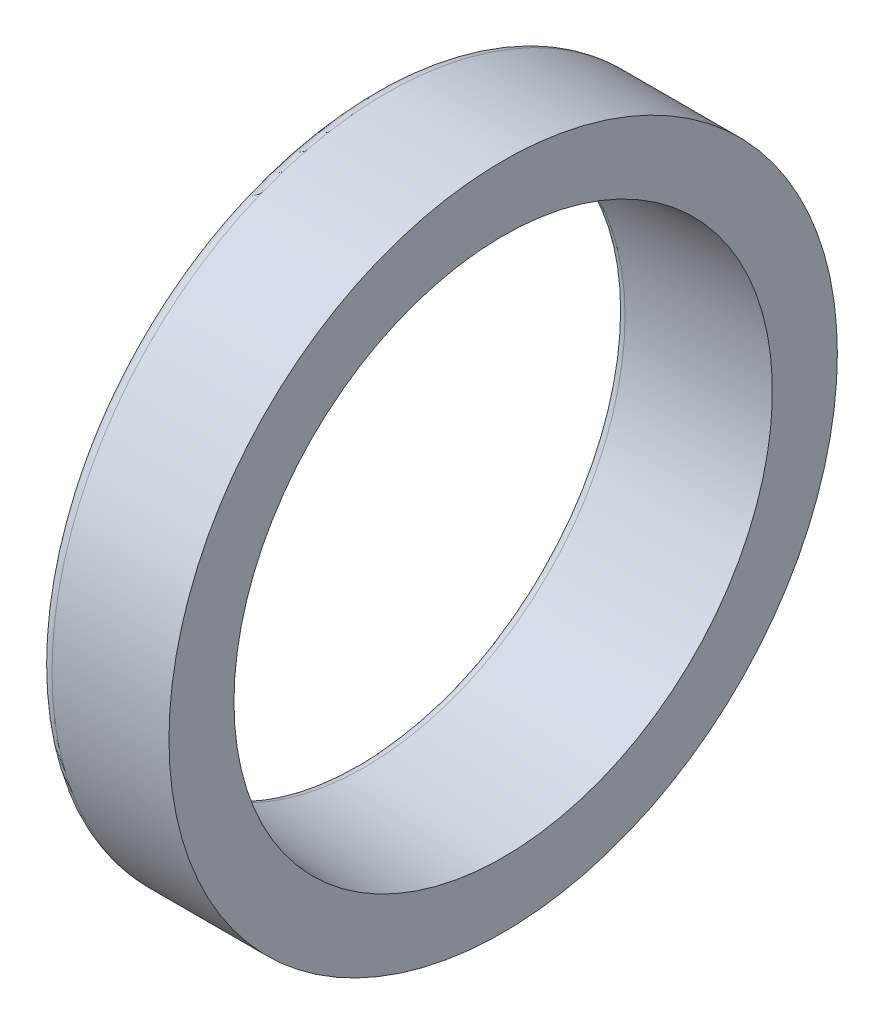
ISO-10303-21;
HEADER;
FILE_DESCRIPTION(('STEP AP214'),'2;1');
FILE_NAME('part.step','',(''),(''),'','','');
FILE_SCHEMA(('AUTOMOTIVE_DESIGN { 1 0 10303 214 1 1 1 1 }'));
ENDSEC;
DATA;
#1=APPLICATION_CONTEXT('core data for automotive mechanical design processes');
#2=APPLICATION_PROTOCOL_DEFINITION('international standard','automotive_design',2000,#1);
#3=PRODUCT_CONTEXT('',#1,'mechanical');
#4=PRODUCT('Part','Part','',(#3));
#5=PRODUCT_RELATED_PRODUCT_CATEGORY('part','',(#4));
#6=PRODUCT_DEFINITION_FORMATION('','',#4);
#7=PRODUCT_DEFINITION_CONTEXT('part definition',#1,'design');
#8=PRODUCT_DEFINITION('design','',#6,#7);
#9=PRODUCT_DEFINITION_SHAPE('','',#8);
#10=(LENGTH_UNIT() NAMED_UNIT(*) SI_UNIT(.MILLI.,.METRE.));
#11=(NAMED_UNIT(*) PLANE_ANGLE_UNIT() SI_UNIT($,.RADIAN.));
#12=(NAMED_UNIT(*) SI_UNIT($,.STERADIAN.) SOLID_ANGLE_UNIT());
#13=UNCERTAINTY_MEASURE_WITH_UNIT(LENGTH_MEASURE(1.E-05),#10,'distance_accuracy_value','');
#14=(GEOMETRIC_REPRESENTATION_CONTEXT(3) GLOBAL_UNCERTAINTY_ASSIGNED_CONTEXT((#13)) GLOBAL_UNIT_ASSIGNED_CONTEXT((#10,
#11,#12)) REPRESENTATION_CONTEXT('',''));
#15=CARTESIAN_POINT('',(0.,0.,0.));
#16=DIRECTION('',(0.,0.,1.));
#17=DIRECTION('',(1.,0.,0.));
#18=AXIS2_PLACEMENT_3D('',#15,#16,#17);
#19=CARTESIAN_POINT('',(-14.021409336133,0.,0.));
#20=DIRECTION('',(-1.,0.,0.));
#21=DIRECTION('',(0.,0.,1.));
#22=AXIS2_PLACEMENT_3D('',#19,#20,#21);
#23=CYLINDRICAL_SURFACE('',#22,18.);
#24=CARTESIAN_POINT('',(-5.3,0.,0.));
#25=DIRECTION('',(-1.,0.,0.));
#26=DIRECTION('',(0.,0.,1.));
#27=AXIS2_PLACEMENT_3D('',#24,#25,#26);
#28=CIRCLE('',#27,18.);
#29=CARTESIAN_POINT('',(-5.3,0.,18.));
#30=VERTEX_POINT('',#29);
#31=EDGE_CURVE('E55',#30,#30,#28,.T.);
#32=ORIENTED_EDGE('',*,*,#31,.F.);
#33=EDGE_LOOP('',(#32));
#34=FACE_BOUND('',#33,.T.);
#35=CARTESIAN_POINT('',(1.,0.,0.));
#36=DIRECTION('',(-1.,0.,0.));
#37=DIRECTION('',(0.,0.,1.));
#38=AXIS2_PLACEMENT_3D('',#35,#36,#37);
#39=CIRCLE('',#38,18.);
#40=CARTESIAN_POINT('',(1.,0.,18.));
#41=VERTEX_POINT('',#40);
#42=EDGE_CURVE('E67',#41,#41,#39,.T.);
#43=ORIENTED_EDGE('',*,*,#42,.T.);
#44=EDGE_LOOP('',(#43));
#45=FACE_BOUND('',#44,.T.);
#46=ADVANCED_FACE('F35',(#34,#45),#23,.T.);
#47=CARTESIAN_POINT('',(-5.3,0.,0.));
#48=DIRECTION('',(-1.,0.,0.));
#49=DIRECTION('',(0.,0.,1.));
#50=AXIS2_PLACEMENT_3D('',#47,#48,#49);
#51=TOROIDAL_SURFACE('',#50,17.3,0.700000000000001);
#52=CARTESIAN_POINT('',(-5.3,0.,0.));
#53=DIRECTION('',(-1.,0.,0.));
#54=DIRECTION('',(0.,0.,1.));
#55=AXIS2_PLACEMENT_3D('',#52,#53,#54);
#56=CIRCLE('',#55,16.6);
#57=CARTESIAN_POINT('',(-5.3,0.,16.6));
#58=VERTEX_POINT('',#57);
#59=EDGE_CURVE('E58',#58,#58,#56,.T.);
#60=ORIENTED_EDGE('',*,*,#59,.F.);
#61=EDGE_LOOP('',(#60));
#62=FACE_BOUND('',#61,.T.);
#63=ORIENTED_EDGE('',*,*,#31,.T.);
#64=EDGE_LOOP('',(#63));
#65=FACE_BOUND('',#64,.T.);
#66=ADVANCED_FACE('F91',(#62,#65),#51,.T.);
#67=CARTESIAN_POINT('',(-5.3,0.,0.));
#68=DIRECTION('',(-1.,0.,0.));
#69=DIRECTION('',(0.,0.,1.));
#70=AXIS2_PLACEMENT_3D('',#67,#68,#69);
#71=TOROIDAL_SURFACE('',#70,15.9,0.699999999999997);
#72=CARTESIAN_POINT('',(-5.22007086739685,0.,0.));
#73=DIRECTION('',(-1.,0.,0.));
#74=DIRECTION('',(0.,0.,1.));
#75=AXIS2_PLACEMENT_3D('',#72,#73,#74);
#76=CIRCLE('',#75,15.2045783050829);
#77=CARTESIAN_POINT('',(-5.22007086739685,0.,15.2045783050829));
#78=VERTEX_POINT('',#77);
#79=EDGE_CURVE('E61',#78,#78,#76,.T.);
#80=ORIENTED_EDGE('',*,*,#79,.F.);
#81=EDGE_LOOP('',(#80));
#82=FACE_BOUND('',#81,.T.);
#83=ORIENTED_EDGE('',*,*,#59,.T.);
#84=EDGE_LOOP('',(#83));
#85=FACE_BOUND('',#84,.T.);
#86=ADVANCED_FACE('F97',(#82,#85),#71,.F.);
#87=CARTESIAN_POINT('',(-5.22007086739685,0.,0.));
#88=DIRECTION('',(1.,0.,0.));
#89=DIRECTION('',(0.,0.,-1.));
#90=AXIS2_PLACEMENT_3D('',#87,#88,#89);
#91=CONICAL_SURFACE('',#90,15.2045783050829,0.114434066989627);
#92=CARTESIAN_POINT('',(-6.5570922375737,0.,0.));
#93=DIRECTION('',(-1.,0.,0.));
#94=DIRECTION('',(0.,0.,1.));
#95=AXIS2_PLACEMENT_3D('',#92,#93,#94);
#96=CIRCLE('',#95,15.0509061387252);
#97=CARTESIAN_POINT('',(-6.5570922375737,0.,15.0509061387252));
#98=VERTEX_POINT('',#97);
#99=EDGE_CURVE('E10',#98,#98,#96,.F.);
#100=ORIENTED_EDGE('',*,*,#99,.T.);
#101=EDGE_LOOP('',(#100));
#102=FACE_BOUND('',#101,.T.);
#103=ORIENTED_EDGE('',*,*,#79,.T.);
#104=EDGE_LOOP('',(#103));
#105=FACE_BOUND('',#104,.T.);
#106=ADVANCED_FACE('F88',(#102,#105),#91,.T.);
#107=CARTESIAN_POINT('',(-7.,14.,0.));
#108=DIRECTION('',(1.,0.,0.));
#109=DIRECTION('',(0.,0.,-1.));
#110=AXIS2_PLACEMENT_3D('',#107,#108,#109);
#111=PLANE('',#110);
#112=CARTESIAN_POINT('',(-7.,0.,0.));
#113=DIRECTION('',(1.,0.,0.));
#114=DIRECTION('',(0.,0.,-1.));
#115=AXIS2_PLACEMENT_3D('',#112,#113,#114);
#116=CIRCLE('',#115,14.5322256106838);
#117=CARTESIAN_POINT('',(-7.,0.,-14.5322256106838));
#118=VERTEX_POINT('',#117);
#119=EDGE_CURVE('E42',#118,#118,#116,.T.);
#120=ORIENTED_EDGE('',*,*,#119,.T.);
#121=EDGE_LOOP('',(#120));
#122=FACE_BOUND('',#121,.T.);
#123=CARTESIAN_POINT('',(-7.,0.,0.));
#124=DIRECTION('',(1.,0.,0.));
#125=DIRECTION('',(0.,0.,-1.));
#126=AXIS2_PLACEMENT_3D('',#123,#124,#125);
#127=CIRCLE('',#126,14.5541763566416);
#128=CARTESIAN_POINT('',(-7.,0.,-14.5541763566416));
#129=VERTEX_POINT('',#128);
#130=EDGE_CURVE('E46',#129,#129,#127,.F.);
#131=ORIENTED_EDGE('',*,*,#130,.T.);
#132=EDGE_LOOP('',(#131));
#133=FACE_BOUND('',#132,.T.);
#134=ADVANCED_FACE('F81',(#122,#133),#111,.F.);
#135=CARTESIAN_POINT('',(-7.,0.,0.));
#136=DIRECTION('',(1.,0.,0.));
#137=DIRECTION('',(0.,0.,-1.));
#138=AXIS2_PLACEMENT_3D('',#135,#136,#137);
#139=CONICAL_SURFACE('',#138,14.,0.0624188099959568);
#140=CARTESIAN_POINT('',(-6.46881085692241,0.,0.));
#141=DIRECTION('',(-1.,0.,0.));
#142=DIRECTION('',(0.,0.,1.));
#143=AXIS2_PLACEMENT_3D('',#140,#141,#142);
#144=CIRCLE('',#143,14.0331993214423);
#145=CARTESIAN_POINT('',(-6.46881085692241,0.,14.0331993214423));
#146=VERTEX_POINT('',#145);
#147=EDGE_CURVE('E50',#146,#146,#144,.T.);
#148=ORIENTED_EDGE('',*,*,#147,.T.);
#149=EDGE_LOOP('',(#148));
#150=FACE_BOUND('',#149,.T.);
#151=CARTESIAN_POINT('',(0.999999999999999,0.,0.));
#152=DIRECTION('',(-1.,0.,0.));
#153=DIRECTION('',(0.,0.,1.));
#154=AXIS2_PLACEMENT_3D('',#151,#152,#153);
#155=CIRCLE('',#154,14.5);
#156=CARTESIAN_POINT('',(0.999999999999999,0.,14.5));
#157=VERTEX_POINT('',#156);
#158=EDGE_CURVE('E64',#157,#157,#155,.T.);
#159=ORIENTED_EDGE('',*,*,#158,.F.);
#160=EDGE_LOOP('',(#159));
#161=FACE_BOUND('',#160,.T.);
#162=ADVANCED_FACE('F76',(#150,#161),#139,.F.);
#163=CARTESIAN_POINT('',(1.,18.,0.));
#164=DIRECTION('',(-1.,0.,0.));
#165=DIRECTION('',(0.,0.,1.));
#166=AXIS2_PLACEMENT_3D('',#163,#164,#165);
#167=PLANE('',#166);
#168=ORIENTED_EDGE('',*,*,#42,.F.);
#169=EDGE_LOOP('',(#168));
#170=FACE_BOUND('',#169,.T.);
#171=ORIENTED_EDGE('',*,*,#158,.T.);
#172=EDGE_LOOP('',(#171));
#173=FACE_BOUND('',#172,.T.);
#174=ADVANCED_FACE('F72',(#170,#173),#167,.F.);
#175=CARTESIAN_POINT('',(-6.5,0.,0.));
#176=DIRECTION('',(1.,0.,0.));
#177=DIRECTION('',(0.,0.,-1.));
#178=AXIS2_PLACEMENT_3D('',#175,#176,#177);
#179=TOROIDAL_SURFACE('',#178,14.5322256106838,0.5);
#180=ORIENTED_EDGE('',*,*,#119,.F.);
#181=EDGE_LOOP('',(#180));
#182=FACE_BOUND('',#181,.T.);
#183=ORIENTED_EDGE('',*,*,#147,.F.);
#184=EDGE_LOOP('',(#183));
#185=FACE_BOUND('',#184,.T.);
#186=ADVANCED_FACE('F75',(#182,#185),#179,.T.);
#187=CARTESIAN_POINT('',(-6.5,0.,0.));
#188=DIRECTION('',(1.,0.,0.));
#189=DIRECTION('',(0.,0.,-1.));
#190=AXIS2_PLACEMENT_3D('',#187,#188,#189);
#191=TOROIDAL_SURFACE('',#190,14.5541763566416,0.5);
#192=ORIENTED_EDGE('',*,*,#99,.F.);
#193=EDGE_LOOP('',(#192));
#194=FACE_BOUND('',#193,.T.);
#195=ORIENTED_EDGE('',*,*,#130,.F.);
#196=EDGE_LOOP('',(#195));
#197=FACE_BOUND('',#196,.T.);
#198=ADVANCED_FACE('F37',(#194,#197),#191,.T.);
#199=CLOSED_SHELL('',(#46,#66,#86,#106,#134,#162,#174,#186,#198));
#200=MANIFOLD_SOLID_BREP('B2',#199);
#201=ADVANCED_BREP_SHAPE_REPRESENTATION('',(#18,#200),#14);
#202=SHAPE_DEFINITION_REPRESENTATION(#9,#201);
ENDSEC;
END-ISO-10303-21;
